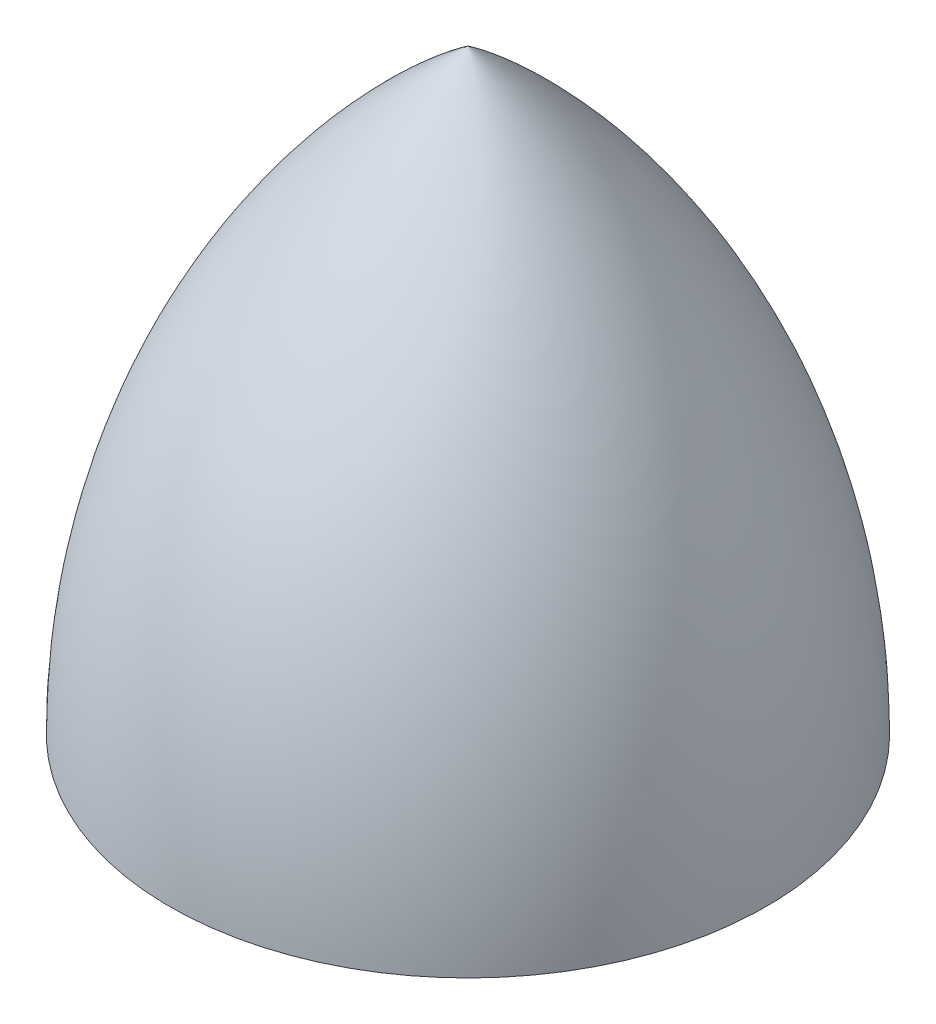
ISO-10303-21;
HEADER;
FILE_DESCRIPTION(('STEP AP214'),'2;1');
FILE_NAME('part.step','',(''),(''),'','','');
FILE_SCHEMA(('AUTOMOTIVE_DESIGN { 1 0 10303 214 1 1 1 1 }'));
ENDSEC;
DATA;
#1=APPLICATION_CONTEXT('core data for automotive mechanical design processes');
#2=APPLICATION_PROTOCOL_DEFINITION('international standard','automotive_design',2000,#1);
#3=PRODUCT_CONTEXT('',#1,'mechanical');
#4=PRODUCT('Part','Part','',(#3));
#5=PRODUCT_RELATED_PRODUCT_CATEGORY('part','',(#4));
#6=PRODUCT_DEFINITION_FORMATION('','',#4);
#7=PRODUCT_DEFINITION_CONTEXT('part definition',#1,'design');
#8=PRODUCT_DEFINITION('design','',#6,#7);
#9=PRODUCT_DEFINITION_SHAPE('','',#8);
#10=(LENGTH_UNIT() NAMED_UNIT(*) SI_UNIT(.MILLI.,.METRE.));
#11=(NAMED_UNIT(*) PLANE_ANGLE_UNIT() SI_UNIT($,.RADIAN.));
#12=(NAMED_UNIT(*) SI_UNIT($,.STERADIAN.) SOLID_ANGLE_UNIT());
#13=UNCERTAINTY_MEASURE_WITH_UNIT(LENGTH_MEASURE(1.E-05),#10,'distance_accuracy_value','');
#14=(GEOMETRIC_REPRESENTATION_CONTEXT(3) GLOBAL_UNCERTAINTY_ASSIGNED_CONTEXT((#13)) GLOBAL_UNIT_ASSIGNED_CONTEXT((#10,
#11,#12)) REPRESENTATION_CONTEXT('',''));
#15=CARTESIAN_POINT('',(0.,0.,0.));
#16=DIRECTION('',(0.,0.,1.));
#17=DIRECTION('',(1.,0.,0.));
#18=AXIS2_PLACEMENT_3D('',#15,#16,#17);
#19=CARTESIAN_POINT('',(22.5,0.,0.));
#20=DIRECTION('',(0.,0.,-1.));
#21=DIRECTION('',(-1.,0.,0.));
#22=AXIS2_PLACEMENT_3D('',#19,#20,#21);
#23=CIRCLE('',#22,37.5);
#24=TRIMMED_CURVE('',#23,(PARAMETER_VALUE(-0.927295218001612)),
(PARAMETER_VALUE(0.927295218001612)),.T.,.PARAMETER.);
#25=CARTESIAN_POINT('',(0.,0.,0.));
#26=DIRECTION('',(0.,1.,0.));
#27=AXIS1_PLACEMENT('',#25,#26);
#28=SURFACE_OF_REVOLUTION('',#24,#27);
#29=CARTESIAN_POINT('',(0.,30.,0.));
#30=VERTEX_POINT('',#29);
#31=VERTEX_LOOP('',#30);
#32=FACE_BOUND('',#31,.T.);
#33=CARTESIAN_POINT('',(0.,0.,0.));
#34=DIRECTION('',(0.,1.,0.));
#35=DIRECTION('',(-1.,0.,0.));
#36=AXIS2_PLACEMENT_3D('',#33,#34,#35);
#37=CIRCLE('',#36,15.);
#38=CARTESIAN_POINT('',(-15.,0.,0.));
#39=VERTEX_POINT('',#38);
#40=EDGE_CURVE('E11',#39,#39,#37,.T.);
#41=ORIENTED_EDGE('',*,*,#40,.T.);
#42=EDGE_LOOP('',(#41));
#43=FACE_BOUND('',#42,.T.);
#44=ADVANCED_FACE('F41',(#32,#43),#28,.T.);
#45=CARTESIAN_POINT('',(0.,0.,0.));
#46=DIRECTION('',(0.,1.,0.));
#47=DIRECTION('',(-1.,0.,0.));
#48=AXIS2_PLACEMENT_3D('',#45,#46,#47);
#49=PLANE('',#48);
#50=ORIENTED_EDGE('',*,*,#40,.F.);
#51=EDGE_LOOP('',(#50));
#52=FACE_BOUND('',#51,.T.);
#53=ADVANCED_FACE('F51',(#52),#49,.F.);
#54=CLOSED_SHELL('',(#44,#53));
#55=MANIFOLD_SOLID_BREP('B2',#54);
#56=ADVANCED_BREP_SHAPE_REPRESENTATION('',(#18,#55),#14);
#57=SHAPE_DEFINITION_REPRESENTATION(#9,#56);
ENDSEC;
END-ISO-10303-21;
